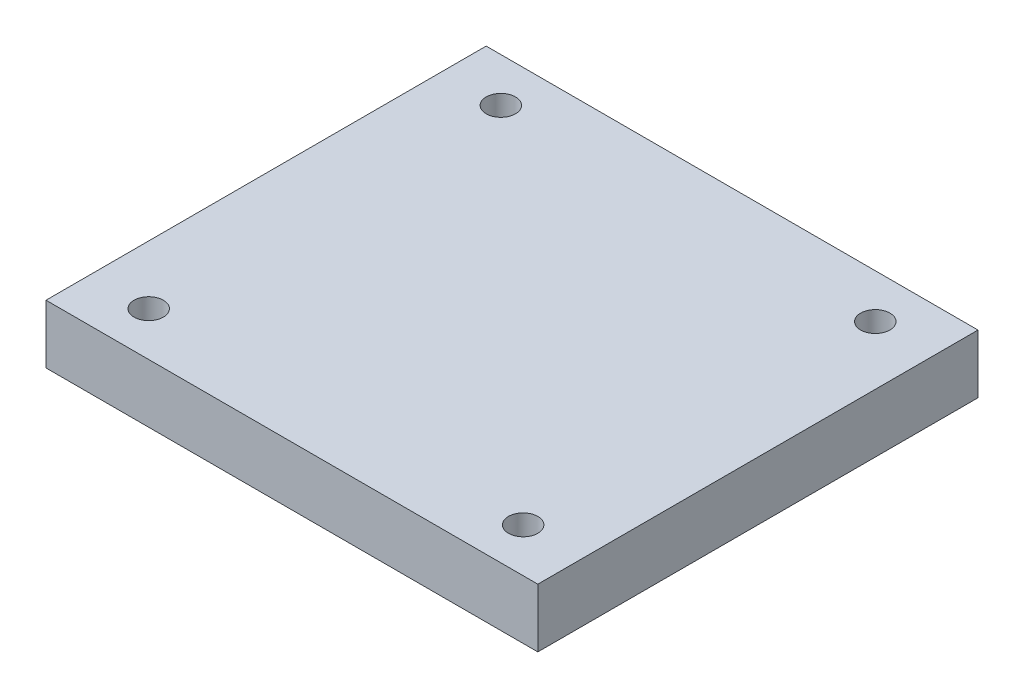
ISO-10303-21;
HEADER;
FILE_DESCRIPTION(('STEP AP214'),'2;1');
FILE_NAME('part.step','',(''),(''),'','','');
FILE_SCHEMA(('AUTOMOTIVE_DESIGN { 1 0 10303 214 1 1 1 1 }'));
ENDSEC;
DATA;
#1=APPLICATION_CONTEXT('core data for automotive mechanical design processes');
#2=APPLICATION_PROTOCOL_DEFINITION('international standard','automotive_design',2000,#1);
#3=PRODUCT_CONTEXT('',#1,'mechanical');
#4=PRODUCT('Part','Part','',(#3));
#5=PRODUCT_RELATED_PRODUCT_CATEGORY('part','',(#4));
#6=PRODUCT_DEFINITION_FORMATION('','',#4);
#7=PRODUCT_DEFINITION_CONTEXT('part definition',#1,'design');
#8=PRODUCT_DEFINITION('design','',#6,#7);
#9=PRODUCT_DEFINITION_SHAPE('','',#8);
#10=(LENGTH_UNIT() NAMED_UNIT(*) SI_UNIT(.MILLI.,.METRE.));
#11=(NAMED_UNIT(*) PLANE_ANGLE_UNIT() SI_UNIT($,.RADIAN.));
#12=(NAMED_UNIT(*) SI_UNIT($,.STERADIAN.) SOLID_ANGLE_UNIT());
#13=UNCERTAINTY_MEASURE_WITH_UNIT(LENGTH_MEASURE(1.E-05),#10,'distance_accuracy_value','');
#14=(GEOMETRIC_REPRESENTATION_CONTEXT(3) GLOBAL_UNCERTAINTY_ASSIGNED_CONTEXT((#13)) GLOBAL_UNIT_ASSIGNED_CONTEXT((#10,
#11,#12)) REPRESENTATION_CONTEXT('',''));
#15=CARTESIAN_POINT('',(0.,0.,0.));
#16=DIRECTION('',(0.,0.,1.));
#17=DIRECTION('',(1.,0.,0.));
#18=AXIS2_PLACEMENT_3D('',#15,#16,#17);
#19=CARTESIAN_POINT('',(0.,12.7,0.));
#20=DIRECTION('',(0.,1.,0.));
#21=DIRECTION('',(0.,0.,1.));
#22=AXIS2_PLACEMENT_3D('',#19,#20,#21);
#23=PLANE('',#22);
#24=CARTESIAN_POINT('',(40.513,12.7,38.1));
#25=DIRECTION('',(0.,1.,0.));
#26=DIRECTION('',(0.,0.,1.));
#27=AXIS2_PLACEMENT_3D('',#24,#25,#26);
#28=CIRCLE('',#27,3.175);
#29=CARTESIAN_POINT('',(40.513,12.7,41.275));
#30=VERTEX_POINT('',#29);
#31=EDGE_CURVE('E121',#30,#30,#28,.T.);
#32=ORIENTED_EDGE('',*,*,#31,.F.);
#33=EDGE_LOOP('',(#32));
#34=FACE_BOUND('',#33,.T.);
#35=CARTESIAN_POINT('',(-40.513,12.7,-38.1));
#36=DIRECTION('',(0.,1.,0.));
#37=DIRECTION('',(0.,0.,1.));
#38=AXIS2_PLACEMENT_3D('',#35,#36,#37);
#39=CIRCLE('',#38,3.175);
#40=CARTESIAN_POINT('',(-40.513,12.7,-34.925));
#41=VERTEX_POINT('',#40);
#42=EDGE_CURVE('E100',#41,#41,#39,.T.);
#43=ORIENTED_EDGE('',*,*,#42,.F.);
#44=EDGE_LOOP('',(#43));
#45=FACE_BOUND('',#44,.T.);
#46=DIRECTION('',(0.,0.,-1.));
#47=VECTOR('',#46,1.);
#48=CARTESIAN_POINT('',(53.213,12.7,-47.625));
#49=LINE('',#48,#47);
#50=CARTESIAN_POINT('',(53.213,12.7,47.625));
#51=VERTEX_POINT('',#50);
#52=CARTESIAN_POINT('',(53.213,12.7,-47.625));
#53=VERTEX_POINT('',#52);
#54=EDGE_CURVE('E85',#51,#53,#49,.T.);
#55=ORIENTED_EDGE('',*,*,#54,.T.);
#56=DIRECTION('',(-1.,0.,0.));
#57=VECTOR('',#56,1.);
#58=CARTESIAN_POINT('',(-53.213,12.7,-47.625));
#59=LINE('',#58,#57);
#60=CARTESIAN_POINT('',(-53.213,12.7,-47.625));
#61=VERTEX_POINT('',#60);
#62=EDGE_CURVE('E80',#53,#61,#59,.T.);
#63=ORIENTED_EDGE('',*,*,#62,.T.);
#64=DIRECTION('',(0.,0.,1.));
#65=VECTOR('',#64,1.);
#66=CARTESIAN_POINT('',(-53.213,12.7,-47.625));
#67=LINE('',#66,#65);
#68=CARTESIAN_POINT('',(-53.213,12.7,47.625));
#69=VERTEX_POINT('',#68);
#70=EDGE_CURVE('E83',#61,#69,#67,.T.);
#71=ORIENTED_EDGE('',*,*,#70,.T.);
#72=DIRECTION('',(1.,0.,0.));
#73=VECTOR('',#72,1.);
#74=CARTESIAN_POINT('',(-53.213,12.7,47.625));
#75=LINE('',#74,#73);
#76=EDGE_CURVE('E50',#69,#51,#75,.T.);
#77=ORIENTED_EDGE('',*,*,#76,.T.);
#78=EDGE_LOOP('',(#55,#63,#71,#77));
#79=FACE_BOUND('',#78,.T.);
#80=CARTESIAN_POINT('',(40.513,12.7,-38.1));
#81=DIRECTION('',(0.,1.,0.));
#82=DIRECTION('',(0.,0.,-1.));
#83=AXIS2_PLACEMENT_3D('',#80,#81,#82);
#84=CIRCLE('',#83,3.175);
#85=CARTESIAN_POINT('',(40.513,12.7,-41.275));
#86=VERTEX_POINT('',#85);
#87=EDGE_CURVE('E115',#86,#86,#84,.T.);
#88=ORIENTED_EDGE('',*,*,#87,.F.);
#89=EDGE_LOOP('',(#88));
#90=FACE_BOUND('',#89,.T.);
#91=CARTESIAN_POINT('',(-40.513,12.7,38.1));
#92=DIRECTION('',(0.,1.,0.));
#93=DIRECTION('',(0.,0.,-1.));
#94=AXIS2_PLACEMENT_3D('',#91,#92,#93);
#95=CIRCLE('',#94,3.175);
#96=CARTESIAN_POINT('',(-40.513,12.7,34.925));
#97=VERTEX_POINT('',#96);
#98=EDGE_CURVE('E127',#97,#97,#95,.T.);
#99=ORIENTED_EDGE('',*,*,#98,.F.);
#100=EDGE_LOOP('',(#99));
#101=FACE_BOUND('',#100,.T.);
#102=ADVANCED_FACE('F33',(#34,#45,#79,#90,#101),#23,.T.);
#103=CARTESIAN_POINT('',(0.,0.,0.));
#104=DIRECTION('',(0.,1.,0.));
#105=DIRECTION('',(0.,0.,1.));
#106=AXIS2_PLACEMENT_3D('',#103,#104,#105);
#107=PLANE('',#106);
#108=DIRECTION('',(0.,0.,-1.));
#109=VECTOR('',#108,1.);
#110=CARTESIAN_POINT('',(53.213,0.,-47.625));
#111=LINE('',#110,#109);
#112=CARTESIAN_POINT('',(53.213,0.,47.625));
#113=VERTEX_POINT('',#112);
#114=CARTESIAN_POINT('',(53.213,0.,-47.625));
#115=VERTEX_POINT('',#114);
#116=EDGE_CURVE('E97',#113,#115,#111,.T.);
#117=ORIENTED_EDGE('',*,*,#116,.F.);
#118=DIRECTION('',(1.,0.,0.));
#119=VECTOR('',#118,1.);
#120=CARTESIAN_POINT('',(-53.213,0.,47.625));
#121=LINE('',#120,#119);
#122=CARTESIAN_POINT('',(-53.213,0.,47.625));
#123=VERTEX_POINT('',#122);
#124=EDGE_CURVE('E73',#123,#113,#121,.T.);
#125=ORIENTED_EDGE('',*,*,#124,.F.);
#126=DIRECTION('',(0.,0.,1.));
#127=VECTOR('',#126,1.);
#128=CARTESIAN_POINT('',(-53.213,0.,-47.625));
#129=LINE('',#128,#127);
#130=CARTESIAN_POINT('',(-53.213,0.,-47.625));
#131=VERTEX_POINT('',#130);
#132=EDGE_CURVE('E67',#131,#123,#129,.T.);
#133=ORIENTED_EDGE('',*,*,#132,.F.);
#134=DIRECTION('',(-1.,0.,0.));
#135=VECTOR('',#134,1.);
#136=CARTESIAN_POINT('',(-53.213,0.,-47.625));
#137=LINE('',#136,#135);
#138=EDGE_CURVE('E89',#115,#131,#137,.T.);
#139=ORIENTED_EDGE('',*,*,#138,.F.);
#140=EDGE_LOOP('',(#117,#125,#133,#139));
#141=FACE_BOUND('',#140,.T.);
#142=CARTESIAN_POINT('',(-40.513,0.,-38.1));
#143=DIRECTION('',(0.,1.,0.));
#144=DIRECTION('',(0.,0.,1.));
#145=AXIS2_PLACEMENT_3D('',#142,#143,#144);
#146=CIRCLE('',#145,3.175);
#147=CARTESIAN_POINT('',(-40.513,0.,-34.925));
#148=VERTEX_POINT('',#147);
#149=EDGE_CURVE('E112',#148,#148,#146,.T.);
#150=ORIENTED_EDGE('',*,*,#149,.T.);
#151=EDGE_LOOP('',(#150));
#152=FACE_BOUND('',#151,.T.);
#153=CARTESIAN_POINT('',(40.513,0.,-38.1));
#154=DIRECTION('',(0.,1.,0.));
#155=DIRECTION('',(0.,0.,-1.));
#156=AXIS2_PLACEMENT_3D('',#153,#154,#155);
#157=CIRCLE('',#156,3.175);
#158=CARTESIAN_POINT('',(40.513,0.,-41.275));
#159=VERTEX_POINT('',#158);
#160=EDGE_CURVE('E118',#159,#159,#157,.T.);
#161=ORIENTED_EDGE('',*,*,#160,.T.);
#162=EDGE_LOOP('',(#161));
#163=FACE_BOUND('',#162,.T.);
#164=CARTESIAN_POINT('',(40.513,0.,38.1));
#165=DIRECTION('',(0.,1.,0.));
#166=DIRECTION('',(0.,0.,1.));
#167=AXIS2_PLACEMENT_3D('',#164,#165,#166);
#168=CIRCLE('',#167,3.175);
#169=CARTESIAN_POINT('',(40.513,0.,41.275));
#170=VERTEX_POINT('',#169);
#171=EDGE_CURVE('E124',#170,#170,#168,.T.);
#172=ORIENTED_EDGE('',*,*,#171,.T.);
#173=EDGE_LOOP('',(#172));
#174=FACE_BOUND('',#173,.T.);
#175=CARTESIAN_POINT('',(-40.513,0.,38.1));
#176=DIRECTION('',(0.,1.,0.));
#177=DIRECTION('',(0.,0.,-1.));
#178=AXIS2_PLACEMENT_3D('',#175,#176,#177);
#179=CIRCLE('',#178,3.175);
#180=CARTESIAN_POINT('',(-40.513,0.,34.925));
#181=VERTEX_POINT('',#180);
#182=EDGE_CURVE('E130',#181,#181,#179,.T.);
#183=ORIENTED_EDGE('',*,*,#182,.T.);
#184=EDGE_LOOP('',(#183));
#185=FACE_BOUND('',#184,.T.);
#186=ADVANCED_FACE('F108',(#141,#152,#163,#174,#185),#107,.F.);
#187=CARTESIAN_POINT('',(53.213,12.7,-47.625));
#188=DIRECTION('',(-1.,0.,0.));
#189=DIRECTION('',(0.,0.,1.));
#190=AXIS2_PLACEMENT_3D('',#187,#188,#189);
#191=PLANE('',#190);
#192=ORIENTED_EDGE('',*,*,#116,.T.);
#193=DIRECTION('',(0.,-1.,0.));
#194=VECTOR('',#193,1.);
#195=CARTESIAN_POINT('',(53.213,12.7,-47.625));
#196=LINE('',#195,#194);
#197=EDGE_CURVE('E11',#53,#115,#196,.T.);
#198=ORIENTED_EDGE('',*,*,#197,.F.);
#199=ORIENTED_EDGE('',*,*,#54,.F.);
#200=DIRECTION('',(0.,-1.,0.));
#201=VECTOR('',#200,1.);
#202=CARTESIAN_POINT('',(53.213,12.7,47.625));
#203=LINE('',#202,#201);
#204=EDGE_CURVE('E93',#51,#113,#203,.T.);
#205=ORIENTED_EDGE('',*,*,#204,.T.);
#206=EDGE_LOOP('',(#192,#198,#199,#205));
#207=FACE_BOUND('',#206,.T.);
#208=ADVANCED_FACE('F35',(#207),#191,.F.);
#209=CARTESIAN_POINT('',(-53.213,12.7,-47.625));
#210=DIRECTION('',(0.,0.,1.));
#211=DIRECTION('',(1.,0.,0.));
#212=AXIS2_PLACEMENT_3D('',#209,#210,#211);
#213=PLANE('',#212);
#214=ORIENTED_EDGE('',*,*,#138,.T.);
#215=DIRECTION('',(0.,-1.,0.));
#216=VECTOR('',#215,1.);
#217=CARTESIAN_POINT('',(-53.213,12.7,-47.625));
#218=LINE('',#217,#216);
#219=EDGE_CURVE('E42',#61,#131,#218,.T.);
#220=ORIENTED_EDGE('',*,*,#219,.F.);
#221=ORIENTED_EDGE('',*,*,#62,.F.);
#222=ORIENTED_EDGE('',*,*,#197,.T.);
#223=EDGE_LOOP('',(#214,#220,#221,#222));
#224=FACE_BOUND('',#223,.T.);
#225=ADVANCED_FACE('F88',(#224),#213,.F.);
#226=CARTESIAN_POINT('',(-53.213,12.7,-47.625));
#227=DIRECTION('',(1.,0.,0.));
#228=DIRECTION('',(0.,0.,-1.));
#229=AXIS2_PLACEMENT_3D('',#226,#227,#228);
#230=PLANE('',#229);
#231=ORIENTED_EDGE('',*,*,#132,.T.);
#232=DIRECTION('',(0.,-1.,0.));
#233=VECTOR('',#232,1.);
#234=CARTESIAN_POINT('',(-53.213,12.7,47.625));
#235=LINE('',#234,#233);
#236=EDGE_CURVE('E90',#69,#123,#235,.T.);
#237=ORIENTED_EDGE('',*,*,#236,.F.);
#238=ORIENTED_EDGE('',*,*,#70,.F.);
#239=ORIENTED_EDGE('',*,*,#219,.T.);
#240=EDGE_LOOP('',(#231,#237,#238,#239));
#241=FACE_BOUND('',#240,.T.);
#242=ADVANCED_FACE('F91',(#241),#230,.F.);
#243=CARTESIAN_POINT('',(-53.213,12.7,47.625));
#244=DIRECTION('',(0.,0.,-1.));
#245=DIRECTION('',(-1.,0.,0.));
#246=AXIS2_PLACEMENT_3D('',#243,#244,#245);
#247=PLANE('',#246);
#248=ORIENTED_EDGE('',*,*,#124,.T.);
#249=ORIENTED_EDGE('',*,*,#204,.F.);
#250=ORIENTED_EDGE('',*,*,#76,.F.);
#251=ORIENTED_EDGE('',*,*,#236,.T.);
#252=EDGE_LOOP('',(#248,#249,#250,#251));
#253=FACE_BOUND('',#252,.T.);
#254=ADVANCED_FACE('F105',(#253),#247,.F.);
#255=CARTESIAN_POINT('',(-40.513,12.7,-38.1));
#256=DIRECTION('',(0.,-1.,0.));
#257=DIRECTION('',(0.,0.,-1.));
#258=AXIS2_PLACEMENT_3D('',#255,#256,#257);
#259=CYLINDRICAL_SURFACE('',#258,3.175);
#260=ORIENTED_EDGE('',*,*,#42,.T.);
#261=EDGE_LOOP('',(#260));
#262=FACE_BOUND('',#261,.T.);
#263=ORIENTED_EDGE('',*,*,#149,.F.);
#264=EDGE_LOOP('',(#263));
#265=FACE_BOUND('',#264,.T.);
#266=ADVANCED_FACE('F149',(#262,#265),#259,.F.);
#267=CARTESIAN_POINT('',(40.513,12.7,-38.1));
#268=DIRECTION('',(0.,-1.,0.));
#269=DIRECTION('',(0.,0.,-1.));
#270=AXIS2_PLACEMENT_3D('',#267,#268,#269);
#271=CYLINDRICAL_SURFACE('',#270,3.175);
#272=ORIENTED_EDGE('',*,*,#87,.T.);
#273=EDGE_LOOP('',(#272));
#274=FACE_BOUND('',#273,.T.);
#275=ORIENTED_EDGE('',*,*,#160,.F.);
#276=EDGE_LOOP('',(#275));
#277=FACE_BOUND('',#276,.T.);
#278=ADVANCED_FACE('F195',(#274,#277),#271,.F.);
#279=CARTESIAN_POINT('',(40.513,12.7,38.1));
#280=DIRECTION('',(0.,-1.,0.));
#281=DIRECTION('',(0.,0.,-1.));
#282=AXIS2_PLACEMENT_3D('',#279,#280,#281);
#283=CYLINDRICAL_SURFACE('',#282,3.175);
#284=ORIENTED_EDGE('',*,*,#31,.T.);
#285=EDGE_LOOP('',(#284));
#286=FACE_BOUND('',#285,.T.);
#287=ORIENTED_EDGE('',*,*,#171,.F.);
#288=EDGE_LOOP('',(#287));
#289=FACE_BOUND('',#288,.T.);
#290=ADVANCED_FACE('F203',(#286,#289),#283,.F.);
#291=CARTESIAN_POINT('',(-40.513,12.7,38.1));
#292=DIRECTION('',(0.,-1.,0.));
#293=DIRECTION('',(0.,0.,-1.));
#294=AXIS2_PLACEMENT_3D('',#291,#292,#293);
#295=CYLINDRICAL_SURFACE('',#294,3.175);
#296=ORIENTED_EDGE('',*,*,#98,.T.);
#297=EDGE_LOOP('',(#296));
#298=FACE_BOUND('',#297,.T.);
#299=ORIENTED_EDGE('',*,*,#182,.F.);
#300=EDGE_LOOP('',(#299));
#301=FACE_BOUND('',#300,.T.);
#302=ADVANCED_FACE('F136',(#298,#301),#295,.F.);
#303=CLOSED_SHELL('',(#102,#186,#208,#225,#242,#254,#266,#278,#290,#302));
#304=MANIFOLD_SOLID_BREP('B2',#303);
#305=ADVANCED_BREP_SHAPE_REPRESENTATION('',(#18,#304),#14);
#306=SHAPE_DEFINITION_REPRESENTATION(#9,#305);
ENDSEC;
END-ISO-10303-21;
